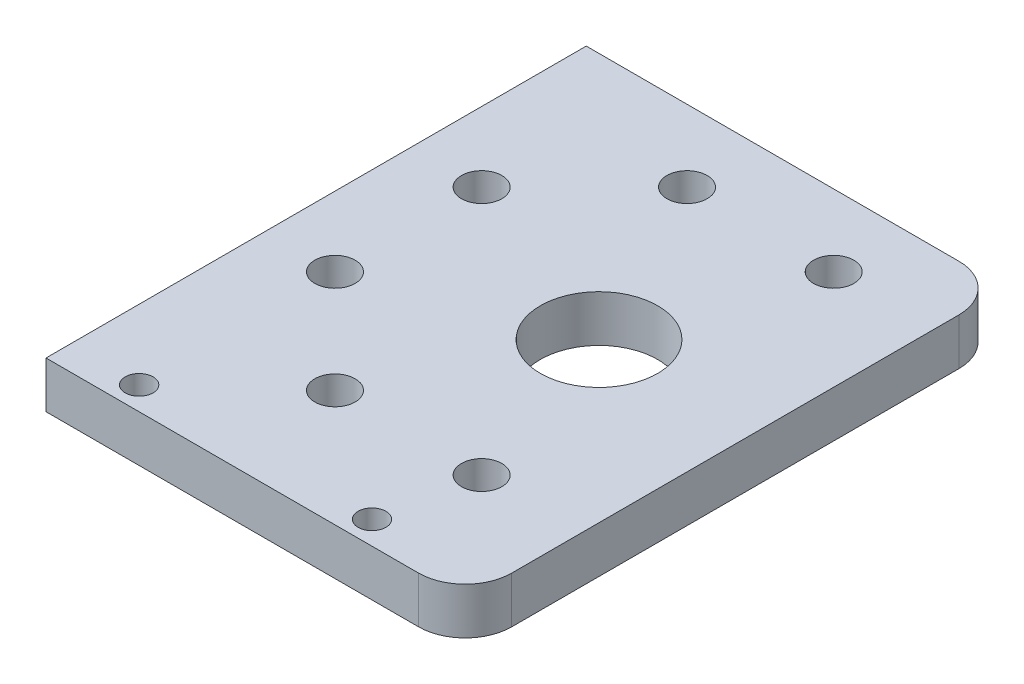
ISO-10303-21;
HEADER;
FILE_DESCRIPTION(('STEP AP214'),'2;1');
FILE_NAME('part.step','',(''),(''),'','','');
FILE_SCHEMA(('AUTOMOTIVE_DESIGN { 1 0 10303 214 1 1 1 1 }'));
ENDSEC;
DATA;
#1=APPLICATION_CONTEXT('core data for automotive mechanical design processes');
#2=APPLICATION_PROTOCOL_DEFINITION('international standard','automotive_design',2000,#1);
#3=PRODUCT_CONTEXT('',#1,'mechanical');
#4=PRODUCT('Part','Part','',(#3));
#5=PRODUCT_RELATED_PRODUCT_CATEGORY('part','',(#4));
#6=PRODUCT_DEFINITION_FORMATION('','',#4);
#7=PRODUCT_DEFINITION_CONTEXT('part definition',#1,'design');
#8=PRODUCT_DEFINITION('design','',#6,#7);
#9=PRODUCT_DEFINITION_SHAPE('','',#8);
#10=(LENGTH_UNIT() NAMED_UNIT(*) SI_UNIT(.MILLI.,.METRE.));
#11=(NAMED_UNIT(*) PLANE_ANGLE_UNIT() SI_UNIT($,.RADIAN.));
#12=(NAMED_UNIT(*) SI_UNIT($,.STERADIAN.) SOLID_ANGLE_UNIT());
#13=UNCERTAINTY_MEASURE_WITH_UNIT(LENGTH_MEASURE(1.E-05),#10,'distance_accuracy_value','');
#14=(GEOMETRIC_REPRESENTATION_CONTEXT(3) GLOBAL_UNCERTAINTY_ASSIGNED_CONTEXT((#13)) GLOBAL_UNIT_ASSIGNED_CONTEXT((#10,
#11,#12)) REPRESENTATION_CONTEXT('',''));
#15=CARTESIAN_POINT('',(0.,0.,0.));
#16=DIRECTION('',(0.,0.,1.));
#17=DIRECTION('',(1.,0.,0.));
#18=AXIS2_PLACEMENT_3D('',#15,#16,#17);
#19=CARTESIAN_POINT('',(-28.575,6.35,-36.83));
#20=DIRECTION('',(1.,0.,0.));
#21=DIRECTION('',(0.,0.,-1.));
#22=AXIS2_PLACEMENT_3D('',#19,#20,#21);
#23=PLANE('',#22);
#24=CARTESIAN_POINT('',(-28.575,3.175,26.67));
#25=DIRECTION('',(-1.,0.,0.));
#26=DIRECTION('',(0.,0.,1.));
#27=AXIS2_PLACEMENT_3D('',#24,#25,#26);
#28=CIRCLE('',#27,1.35255);
#29=CARTESIAN_POINT('',(-28.575,3.175,28.02255));
#30=VERTEX_POINT('',#29);
#31=EDGE_CURVE('E104',#30,#30,#28,.T.);
#32=ORIENTED_EDGE('',*,*,#31,.F.);
#33=EDGE_LOOP('',(#32));
#34=FACE_BOUND('',#33,.T.);
#35=CARTESIAN_POINT('',(-28.575,3.175,-21.59));
#36=DIRECTION('',(-1.,0.,0.));
#37=DIRECTION('',(0.,0.,1.));
#38=AXIS2_PLACEMENT_3D('',#35,#36,#37);
#39=CIRCLE('',#38,1.35255);
#40=CARTESIAN_POINT('',(-28.575,3.175,-20.23745));
#41=VERTEX_POINT('',#40);
#42=EDGE_CURVE('E103',#41,#41,#39,.T.);
#43=ORIENTED_EDGE('',*,*,#42,.F.);
#44=EDGE_LOOP('',(#43));
#45=FACE_BOUND('',#44,.T.);
#46=DIRECTION('',(0.,0.,1.));
#47=VECTOR('',#46,1.);
#48=CARTESIAN_POINT('',(-28.575,0.,-36.83));
#49=LINE('',#48,#47);
#50=CARTESIAN_POINT('',(-28.575,0.,-36.83));
#51=VERTEX_POINT('',#50);
#52=CARTESIAN_POINT('',(-28.575,0.,36.83));
#53=VERTEX_POINT('',#52);
#54=EDGE_CURVE('E162',#51,#53,#49,.T.);
#55=ORIENTED_EDGE('',*,*,#54,.T.);
#56=DIRECTION('',(0.,-1.,0.));
#57=VECTOR('',#56,1.);
#58=CARTESIAN_POINT('',(-28.575,6.35,36.83));
#59=LINE('',#58,#57);
#60=CARTESIAN_POINT('',(-28.575,6.35,36.83));
#61=VERTEX_POINT('',#60);
#62=EDGE_CURVE('E185',#61,#53,#59,.T.);
#63=ORIENTED_EDGE('',*,*,#62,.F.);
#64=DIRECTION('',(0.,0.,1.));
#65=VECTOR('',#64,1.);
#66=CARTESIAN_POINT('',(-28.575,6.35,-36.83));
#67=LINE('',#66,#65);
#68=CARTESIAN_POINT('',(-28.575,6.35,-36.83));
#69=VERTEX_POINT('',#68);
#70=EDGE_CURVE('E163',#69,#61,#67,.T.);
#71=ORIENTED_EDGE('',*,*,#70,.F.);
#72=DIRECTION('',(0.,-1.,0.));
#73=VECTOR('',#72,1.);
#74=CARTESIAN_POINT('',(-28.575,6.35,-36.83));
#75=LINE('',#74,#73);
#76=EDGE_CURVE('E174',#69,#51,#75,.T.);
#77=ORIENTED_EDGE('',*,*,#76,.T.);
#78=EDGE_LOOP('',(#55,#63,#71,#77));
#79=FACE_BOUND('',#78,.T.);
#80=ADVANCED_FACE('F33',(#34,#45,#79),#23,.F.);
#81=CARTESIAN_POINT('',(-28.575,6.35,36.83));
#82=DIRECTION('',(0.,0.,-1.));
#83=DIRECTION('',(-1.,0.,0.));
#84=AXIS2_PLACEMENT_3D('',#81,#82,#83);
#85=PLANE('',#84);
#86=DIRECTION('',(1.,0.,0.));
#87=VECTOR('',#86,1.);
#88=CARTESIAN_POINT('',(-28.575,0.,36.83));
#89=LINE('',#88,#87);
#90=CARTESIAN_POINT('',(22.225,0.,36.83));
#91=VERTEX_POINT('',#90);
#92=EDGE_CURVE('E177',#53,#91,#89,.T.);
#93=ORIENTED_EDGE('',*,*,#92,.T.);
#94=DIRECTION('',(0.,-1.,0.));
#95=VECTOR('',#94,1.);
#96=CARTESIAN_POINT('',(22.225,6.35,36.83));
#97=LINE('',#96,#95);
#98=CARTESIAN_POINT('',(22.225,6.35,36.83));
#99=VERTEX_POINT('',#98);
#100=EDGE_CURVE('E56',#91,#99,#97,.F.);
#101=ORIENTED_EDGE('',*,*,#100,.T.);
#102=DIRECTION('',(1.,0.,0.));
#103=VECTOR('',#102,1.);
#104=CARTESIAN_POINT('',(-28.575,6.35,36.83));
#105=LINE('',#104,#103);
#106=EDGE_CURVE('E166',#61,#99,#105,.T.);
#107=ORIENTED_EDGE('',*,*,#106,.F.);
#108=ORIENTED_EDGE('',*,*,#62,.T.);
#109=EDGE_LOOP('',(#93,#101,#107,#108));
#110=FACE_BOUND('',#109,.T.);
#111=ADVANCED_FACE('F216',(#110),#85,.F.);
#112=CARTESIAN_POINT('',(28.575,6.35,-36.83));
#113=DIRECTION('',(1.,0.,0.));
#114=DIRECTION('',(0.,0.,-1.));
#115=AXIS2_PLACEMENT_3D('',#112,#113,#114);
#116=PLANE('',#115);
#117=DIRECTION('',(0.,0.,1.));
#118=VECTOR('',#117,1.);
#119=CARTESIAN_POINT('',(28.575,6.35,-36.83));
#120=LINE('',#119,#118);
#121=CARTESIAN_POINT('',(28.575,6.35,-30.48));
#122=VERTEX_POINT('',#121);
#123=CARTESIAN_POINT('',(28.575,6.35,30.48));
#124=VERTEX_POINT('',#123);
#125=EDGE_CURVE('E169',#122,#124,#120,.T.);
#126=ORIENTED_EDGE('',*,*,#125,.T.);
#127=DIRECTION('',(0.,-1.,0.));
#128=VECTOR('',#127,1.);
#129=CARTESIAN_POINT('',(28.575,0.,30.48));
#130=LINE('',#129,#128);
#131=CARTESIAN_POINT('',(28.575,0.,30.48));
#132=VERTEX_POINT('',#131);
#133=EDGE_CURVE('E196',#124,#132,#130,.T.);
#134=ORIENTED_EDGE('',*,*,#133,.T.);
#135=DIRECTION('',(0.,0.,1.));
#136=VECTOR('',#135,1.);
#137=CARTESIAN_POINT('',(28.575,0.,-36.83));
#138=LINE('',#137,#136);
#139=CARTESIAN_POINT('',(28.575,0.,-30.48));
#140=VERTEX_POINT('',#139);
#141=EDGE_CURVE('E179',#140,#132,#138,.T.);
#142=ORIENTED_EDGE('',*,*,#141,.F.);
#143=DIRECTION('',(0.,-1.,0.));
#144=VECTOR('',#143,1.);
#145=CARTESIAN_POINT('',(28.575,6.35,-30.48));
#146=LINE('',#145,#144);
#147=EDGE_CURVE('E188',#140,#122,#146,.F.);
#148=ORIENTED_EDGE('',*,*,#147,.T.);
#149=EDGE_LOOP('',(#126,#134,#142,#148));
#150=FACE_BOUND('',#149,.T.);
#151=ADVANCED_FACE('F209',(#150),#116,.T.);
#152=CARTESIAN_POINT('',(-28.575,6.35,-36.83));
#153=DIRECTION('',(0.,0.,-1.));
#154=DIRECTION('',(-1.,0.,0.));
#155=AXIS2_PLACEMENT_3D('',#152,#153,#154);
#156=PLANE('',#155);
#157=DIRECTION('',(1.,0.,0.));
#158=VECTOR('',#157,1.);
#159=CARTESIAN_POINT('',(-28.575,6.35,-36.83));
#160=LINE('',#159,#158);
#161=CARTESIAN_POINT('',(22.225,6.35,-36.83));
#162=VERTEX_POINT('',#161);
#163=EDGE_CURVE('E172',#69,#162,#160,.T.);
#164=ORIENTED_EDGE('',*,*,#163,.T.);
#165=DIRECTION('',(0.,-1.,0.));
#166=VECTOR('',#165,1.);
#167=CARTESIAN_POINT('',(22.225,6.35,-36.83));
#168=LINE('',#167,#166);
#169=CARTESIAN_POINT('',(22.225,0.,-36.83));
#170=VERTEX_POINT('',#169);
#171=EDGE_CURVE('E11',#162,#170,#168,.T.);
#172=ORIENTED_EDGE('',*,*,#171,.T.);
#173=DIRECTION('',(1.,0.,0.));
#174=VECTOR('',#173,1.);
#175=CARTESIAN_POINT('',(-28.575,0.,-36.83));
#176=LINE('',#175,#174);
#177=EDGE_CURVE('E167',#51,#170,#176,.T.);
#178=ORIENTED_EDGE('',*,*,#177,.F.);
#179=ORIENTED_EDGE('',*,*,#76,.F.);
#180=EDGE_LOOP('',(#164,#172,#178,#179));
#181=FACE_BOUND('',#180,.T.);
#182=ADVANCED_FACE('F222',(#181),#156,.T.);
#183=CARTESIAN_POINT('',(0.,6.35,0.));
#184=DIRECTION('',(0.,1.,0.));
#185=DIRECTION('',(0.,0.,1.));
#186=AXIS2_PLACEMENT_3D('',#183,#184,#185);
#187=PLANE('',#186);
#188=CARTESIAN_POINT('',(6.94999999999999,6.35,-3.04500000600001));
#189=DIRECTION('',(0.,1.,0.));
#190=DIRECTION('',(0.,0.,1.));
#191=AXIS2_PLACEMENT_3D('',#188,#189,#190);
#192=CIRCLE('',#191,8.);
#193=CARTESIAN_POINT('',(6.94999999999999,6.35,4.95499999399999));
#194=VERTEX_POINT('',#193);
#195=EDGE_CURVE('E114',#194,#194,#192,.T.);
#196=ORIENTED_EDGE('',*,*,#195,.F.);
#197=EDGE_LOOP('',(#196));
#198=FACE_BOUND('',#197,.T.);
#199=CARTESIAN_POINT('',(-19.05,6.35,-13.045000006));
#200=DIRECTION('',(0.,1.,0.));
#201=DIRECTION('',(0.,0.,1.));
#202=AXIS2_PLACEMENT_3D('',#199,#200,#201);
#203=CIRCLE('',#202,2.75);
#204=CARTESIAN_POINT('',(-19.05,6.35,-10.295000006));
#205=VERTEX_POINT('',#204);
#206=EDGE_CURVE('E118',#205,#205,#203,.T.);
#207=ORIENTED_EDGE('',*,*,#206,.F.);
#208=EDGE_LOOP('',(#207));
#209=FACE_BOUND('',#208,.T.);
#210=CARTESIAN_POINT('',(-19.05,6.35,6.95499999399998));
#211=DIRECTION('',(0.,1.,0.));
#212=DIRECTION('',(0.,0.,1.));
#213=AXIS2_PLACEMENT_3D('',#210,#211,#212);
#214=CIRCLE('',#213,2.75);
#215=CARTESIAN_POINT('',(-19.05,6.35,9.70499999399998));
#216=VERTEX_POINT('',#215);
#217=EDGE_CURVE('E126',#216,#216,#214,.T.);
#218=ORIENTED_EDGE('',*,*,#217,.F.);
#219=EDGE_LOOP('',(#218));
#220=FACE_BOUND('',#219,.T.);
#221=CARTESIAN_POINT('',(14.95,6.35,-27.045));
#222=DIRECTION('',(0.,1.,0.));
#223=DIRECTION('',(0.,0.,1.));
#224=AXIS2_PLACEMENT_3D('',#221,#222,#223);
#225=CIRCLE('',#224,2.75);
#226=CARTESIAN_POINT('',(14.95,6.35,-24.295));
#227=VERTEX_POINT('',#226);
#228=EDGE_CURVE('E130',#227,#227,#225,.T.);
#229=ORIENTED_EDGE('',*,*,#228,.F.);
#230=EDGE_LOOP('',(#229));
#231=FACE_BOUND('',#230,.T.);
#232=CARTESIAN_POINT('',(14.95,6.35,20.955));
#233=DIRECTION('',(0.,1.,0.));
#234=DIRECTION('',(0.,0.,1.));
#235=AXIS2_PLACEMENT_3D('',#232,#233,#234);
#236=CIRCLE('',#235,2.75);
#237=CARTESIAN_POINT('',(14.95,6.35,23.705));
#238=VERTEX_POINT('',#237);
#239=EDGE_CURVE('E134',#238,#238,#236,.T.);
#240=ORIENTED_EDGE('',*,*,#239,.F.);
#241=EDGE_LOOP('',(#240));
#242=FACE_BOUND('',#241,.T.);
#243=CARTESIAN_POINT('',(-5.05000000000001,6.35,-27.045));
#244=DIRECTION('',(0.,1.,0.));
#245=DIRECTION('',(0.,0.,1.));
#246=AXIS2_PLACEMENT_3D('',#243,#244,#245);
#247=CIRCLE('',#246,2.75);
#248=CARTESIAN_POINT('',(-5.05000000000001,6.35,-24.295));
#249=VERTEX_POINT('',#248);
#250=EDGE_CURVE('E140',#249,#249,#247,.T.);
#251=ORIENTED_EDGE('',*,*,#250,.F.);
#252=EDGE_LOOP('',(#251));
#253=FACE_BOUND('',#252,.T.);
#254=CARTESIAN_POINT('',(-5.05000000000001,6.35,20.955));
#255=DIRECTION('',(0.,1.,0.));
#256=DIRECTION('',(0.,0.,1.));
#257=AXIS2_PLACEMENT_3D('',#254,#255,#256);
#258=CIRCLE('',#257,2.75);
#259=CARTESIAN_POINT('',(-5.05000000000001,6.35,23.705));
#260=VERTEX_POINT('',#259);
#261=EDGE_CURVE('E144',#260,#260,#258,.T.);
#262=ORIENTED_EDGE('',*,*,#261,.F.);
#263=EDGE_LOOP('',(#262));
#264=FACE_BOUND('',#263,.T.);
#265=CARTESIAN_POINT('',(-19.05,6.35,33.655));
#266=DIRECTION('',(0.,1.,0.));
#267=DIRECTION('',(0.,0.,1.));
#268=AXIS2_PLACEMENT_3D('',#265,#266,#267);
#269=CIRCLE('',#268,1.89865);
#270=CARTESIAN_POINT('',(-19.05,6.35,35.55365));
#271=VERTEX_POINT('',#270);
#272=EDGE_CURVE('E150',#271,#271,#269,.T.);
#273=ORIENTED_EDGE('',*,*,#272,.F.);
#274=EDGE_LOOP('',(#273));
#275=FACE_BOUND('',#274,.T.);
#276=CARTESIAN_POINT('',(12.7,6.35,33.655));
#277=DIRECTION('',(0.,1.,0.));
#278=DIRECTION('',(0.,0.,1.));
#279=AXIS2_PLACEMENT_3D('',#276,#277,#278);
#280=CIRCLE('',#279,1.89865);
#281=CARTESIAN_POINT('',(12.7,6.35,35.55365));
#282=VERTEX_POINT('',#281);
#283=EDGE_CURVE('E156',#282,#282,#280,.T.);
#284=ORIENTED_EDGE('',*,*,#283,.F.);
#285=EDGE_LOOP('',(#284));
#286=FACE_BOUND('',#285,.T.);
#287=ORIENTED_EDGE('',*,*,#106,.T.);
#288=CARTESIAN_POINT('',(22.225,6.35,30.48));
#289=DIRECTION('',(0.,1.,0.));
#290=DIRECTION('',(0.,0.,1.));
#291=AXIS2_PLACEMENT_3D('',#288,#289,#290);
#292=CIRCLE('',#291,6.35);
#293=EDGE_CURVE('E41',#99,#124,#292,.T.);
#294=ORIENTED_EDGE('',*,*,#293,.T.);
#295=ORIENTED_EDGE('',*,*,#125,.F.);
#296=CARTESIAN_POINT('',(22.225,6.35,-30.48));
#297=DIRECTION('',(0.,1.,0.));
#298=DIRECTION('',(0.,0.,1.));
#299=AXIS2_PLACEMENT_3D('',#296,#297,#298);
#300=CIRCLE('',#299,6.35);
#301=EDGE_CURVE('E48',#122,#162,#300,.T.);
#302=ORIENTED_EDGE('',*,*,#301,.T.);
#303=ORIENTED_EDGE('',*,*,#163,.F.);
#304=ORIENTED_EDGE('',*,*,#70,.T.);
#305=EDGE_LOOP('',(#287,#294,#295,#302,#303,#304));
#306=FACE_BOUND('',#305,.T.);
#307=ADVANCED_FACE('F205',(#198,#209,#220,#231,#242,#253,#264,#275,#286,#306),#187,.T.);
#308=CARTESIAN_POINT('',(0.,0.,0.));
#309=DIRECTION('',(0.,1.,0.));
#310=DIRECTION('',(0.,0.,1.));
#311=AXIS2_PLACEMENT_3D('',#308,#309,#310);
#312=PLANE('',#311);
#313=CARTESIAN_POINT('',(6.94999999999999,0.,-3.04500000600001));
#314=DIRECTION('',(0.,1.,0.));
#315=DIRECTION('',(0.,0.,1.));
#316=AXIS2_PLACEMENT_3D('',#313,#314,#315);
#317=CIRCLE('',#316,8.);
#318=CARTESIAN_POINT('',(6.94999999999999,0.,4.95499999399999));
#319=VERTEX_POINT('',#318);
#320=EDGE_CURVE('E115',#319,#319,#317,.T.);
#321=ORIENTED_EDGE('',*,*,#320,.T.);
#322=EDGE_LOOP('',(#321));
#323=FACE_BOUND('',#322,.T.);
#324=CARTESIAN_POINT('',(-19.05,0.,-13.045000006));
#325=DIRECTION('',(0.,1.,0.));
#326=DIRECTION('',(0.,0.,1.));
#327=AXIS2_PLACEMENT_3D('',#324,#325,#326);
#328=CIRCLE('',#327,2.75);
#329=CARTESIAN_POINT('',(-19.05,0.,-10.295000006));
#330=VERTEX_POINT('',#329);
#331=EDGE_CURVE('E123',#330,#330,#328,.T.);
#332=ORIENTED_EDGE('',*,*,#331,.T.);
#333=EDGE_LOOP('',(#332));
#334=FACE_BOUND('',#333,.T.);
#335=CARTESIAN_POINT('',(-19.05,0.,6.95499999399998));
#336=DIRECTION('',(0.,1.,0.));
#337=DIRECTION('',(0.,0.,1.));
#338=AXIS2_PLACEMENT_3D('',#335,#336,#337);
#339=CIRCLE('',#338,2.75);
#340=CARTESIAN_POINT('',(-19.05,0.,9.70499999399998));
#341=VERTEX_POINT('',#340);
#342=EDGE_CURVE('E129',#341,#341,#339,.T.);
#343=ORIENTED_EDGE('',*,*,#342,.T.);
#344=EDGE_LOOP('',(#343));
#345=FACE_BOUND('',#344,.T.);
#346=CARTESIAN_POINT('',(14.95,0.,-27.045));
#347=DIRECTION('',(0.,1.,0.));
#348=DIRECTION('',(0.,0.,1.));
#349=AXIS2_PLACEMENT_3D('',#346,#347,#348);
#350=CIRCLE('',#349,2.75);
#351=CARTESIAN_POINT('',(14.95,0.,-24.295));
#352=VERTEX_POINT('',#351);
#353=EDGE_CURVE('E133',#352,#352,#350,.T.);
#354=ORIENTED_EDGE('',*,*,#353,.T.);
#355=EDGE_LOOP('',(#354));
#356=FACE_BOUND('',#355,.T.);
#357=CARTESIAN_POINT('',(14.95,0.,20.955));
#358=DIRECTION('',(0.,1.,0.));
#359=DIRECTION('',(0.,0.,1.));
#360=AXIS2_PLACEMENT_3D('',#357,#358,#359);
#361=CIRCLE('',#360,2.75);
#362=CARTESIAN_POINT('',(14.95,0.,23.705));
#363=VERTEX_POINT('',#362);
#364=EDGE_CURVE('E137',#363,#363,#361,.T.);
#365=ORIENTED_EDGE('',*,*,#364,.T.);
#366=EDGE_LOOP('',(#365));
#367=FACE_BOUND('',#366,.T.);
#368=CARTESIAN_POINT('',(-5.05000000000001,0.,-27.045));
#369=DIRECTION('',(0.,1.,0.));
#370=DIRECTION('',(0.,0.,1.));
#371=AXIS2_PLACEMENT_3D('',#368,#369,#370);
#372=CIRCLE('',#371,2.75);
#373=CARTESIAN_POINT('',(-5.05000000000001,0.,-24.295));
#374=VERTEX_POINT('',#373);
#375=EDGE_CURVE('E143',#374,#374,#372,.T.);
#376=ORIENTED_EDGE('',*,*,#375,.T.);
#377=EDGE_LOOP('',(#376));
#378=FACE_BOUND('',#377,.T.);
#379=CARTESIAN_POINT('',(-5.05000000000001,0.,20.955));
#380=DIRECTION('',(0.,1.,0.));
#381=DIRECTION('',(0.,0.,1.));
#382=AXIS2_PLACEMENT_3D('',#379,#380,#381);
#383=CIRCLE('',#382,2.75);
#384=CARTESIAN_POINT('',(-5.05000000000001,0.,23.705));
#385=VERTEX_POINT('',#384);
#386=EDGE_CURVE('E147',#385,#385,#383,.T.);
#387=ORIENTED_EDGE('',*,*,#386,.T.);
#388=EDGE_LOOP('',(#387));
#389=FACE_BOUND('',#388,.T.);
#390=CARTESIAN_POINT('',(-19.05,0.,33.655));
#391=DIRECTION('',(0.,1.,0.));
#392=DIRECTION('',(0.,0.,1.));
#393=AXIS2_PLACEMENT_3D('',#390,#391,#392);
#394=CIRCLE('',#393,1.89865);
#395=CARTESIAN_POINT('',(-19.05,0.,35.55365));
#396=VERTEX_POINT('',#395);
#397=EDGE_CURVE('E153',#396,#396,#394,.T.);
#398=ORIENTED_EDGE('',*,*,#397,.T.);
#399=EDGE_LOOP('',(#398));
#400=FACE_BOUND('',#399,.T.);
#401=CARTESIAN_POINT('',(12.7,0.,33.655));
#402=DIRECTION('',(0.,1.,0.));
#403=DIRECTION('',(0.,0.,1.));
#404=AXIS2_PLACEMENT_3D('',#401,#402,#403);
#405=CIRCLE('',#404,1.89865);
#406=CARTESIAN_POINT('',(12.7,0.,35.55365));
#407=VERTEX_POINT('',#406);
#408=EDGE_CURVE('E159',#407,#407,#405,.T.);
#409=ORIENTED_EDGE('',*,*,#408,.T.);
#410=EDGE_LOOP('',(#409));
#411=FACE_BOUND('',#410,.T.);
#412=ORIENTED_EDGE('',*,*,#141,.T.);
#413=CARTESIAN_POINT('',(22.225,0.,30.48));
#414=DIRECTION('',(0.,1.,0.));
#415=DIRECTION('',(0.,0.,1.));
#416=AXIS2_PLACEMENT_3D('',#413,#414,#415);
#417=CIRCLE('',#416,6.35);
#418=EDGE_CURVE('E201',#132,#91,#417,.F.);
#419=ORIENTED_EDGE('',*,*,#418,.T.);
#420=ORIENTED_EDGE('',*,*,#92,.F.);
#421=ORIENTED_EDGE('',*,*,#54,.F.);
#422=ORIENTED_EDGE('',*,*,#177,.T.);
#423=CARTESIAN_POINT('',(22.225,0.,-30.48));
#424=DIRECTION('',(0.,1.,0.));
#425=DIRECTION('',(0.,0.,1.));
#426=AXIS2_PLACEMENT_3D('',#423,#424,#425);
#427=CIRCLE('',#426,6.35);
#428=EDGE_CURVE('E199',#170,#140,#427,.F.);
#429=ORIENTED_EDGE('',*,*,#428,.T.);
#430=EDGE_LOOP('',(#412,#419,#420,#421,#422,#429));
#431=FACE_BOUND('',#430,.T.);
#432=ADVANCED_FACE('F214',(#323,#334,#345,#356,#367,#378,#389,#400,#411,#431),#312,.F.);
#433=CARTESIAN_POINT('',(12.7,6.35,33.655));
#434=DIRECTION('',(0.,1.,0.));
#435=DIRECTION('',(0.,0.,1.));
#436=AXIS2_PLACEMENT_3D('',#433,#434,#435);
#437=CYLINDRICAL_SURFACE('',#436,1.89865);
#438=ORIENTED_EDGE('',*,*,#283,.T.);
#439=EDGE_LOOP('',(#438));
#440=FACE_BOUND('',#439,.T.);
#441=ORIENTED_EDGE('',*,*,#408,.F.);
#442=EDGE_LOOP('',(#441));
#443=FACE_BOUND('',#442,.T.);
#444=ADVANCED_FACE('F245',(#440,#443),#437,.F.);
#445=CARTESIAN_POINT('',(-19.05,6.35,33.655));
#446=DIRECTION('',(0.,1.,0.));
#447=DIRECTION('',(0.,0.,1.));
#448=AXIS2_PLACEMENT_3D('',#445,#446,#447);
#449=CYLINDRICAL_SURFACE('',#448,1.89865);
#450=ORIENTED_EDGE('',*,*,#272,.T.);
#451=EDGE_LOOP('',(#450));
#452=FACE_BOUND('',#451,.T.);
#453=ORIENTED_EDGE('',*,*,#397,.F.);
#454=EDGE_LOOP('',(#453));
#455=FACE_BOUND('',#454,.T.);
#456=ADVANCED_FACE('F252',(#452,#455),#449,.F.);
#457=CARTESIAN_POINT('',(-5.05000000000001,6.35,20.955));
#458=DIRECTION('',(0.,1.,0.));
#459=DIRECTION('',(0.,0.,1.));
#460=AXIS2_PLACEMENT_3D('',#457,#458,#459);
#461=CYLINDRICAL_SURFACE('',#460,2.75);
#462=ORIENTED_EDGE('',*,*,#261,.T.);
#463=EDGE_LOOP('',(#462));
#464=FACE_BOUND('',#463,.T.);
#465=ORIENTED_EDGE('',*,*,#386,.F.);
#466=EDGE_LOOP('',(#465));
#467=FACE_BOUND('',#466,.T.);
#468=ADVANCED_FACE('F256',(#464,#467),#461,.F.);
#469=CARTESIAN_POINT('',(-5.05000000000001,6.35,-27.045));
#470=DIRECTION('',(0.,1.,0.));
#471=DIRECTION('',(0.,0.,1.));
#472=AXIS2_PLACEMENT_3D('',#469,#470,#471);
#473=CYLINDRICAL_SURFACE('',#472,2.75);
#474=ORIENTED_EDGE('',*,*,#250,.T.);
#475=EDGE_LOOP('',(#474));
#476=FACE_BOUND('',#475,.T.);
#477=ORIENTED_EDGE('',*,*,#375,.F.);
#478=EDGE_LOOP('',(#477));
#479=FACE_BOUND('',#478,.T.);
#480=ADVANCED_FACE('F260',(#476,#479),#473,.F.);
#481=CARTESIAN_POINT('',(14.95,6.35,20.955));
#482=DIRECTION('',(0.,1.,0.));
#483=DIRECTION('',(0.,0.,1.));
#484=AXIS2_PLACEMENT_3D('',#481,#482,#483);
#485=CYLINDRICAL_SURFACE('',#484,2.75);
#486=ORIENTED_EDGE('',*,*,#239,.T.);
#487=EDGE_LOOP('',(#486));
#488=FACE_BOUND('',#487,.T.);
#489=ORIENTED_EDGE('',*,*,#364,.F.);
#490=EDGE_LOOP('',(#489));
#491=FACE_BOUND('',#490,.T.);
#492=ADVANCED_FACE('F264',(#488,#491),#485,.F.);
#493=CARTESIAN_POINT('',(14.95,6.35,-27.045));
#494=DIRECTION('',(0.,1.,0.));
#495=DIRECTION('',(0.,0.,1.));
#496=AXIS2_PLACEMENT_3D('',#493,#494,#495);
#497=CYLINDRICAL_SURFACE('',#496,2.75);
#498=ORIENTED_EDGE('',*,*,#228,.T.);
#499=EDGE_LOOP('',(#498));
#500=FACE_BOUND('',#499,.T.);
#501=ORIENTED_EDGE('',*,*,#353,.F.);
#502=EDGE_LOOP('',(#501));
#503=FACE_BOUND('',#502,.T.);
#504=ADVANCED_FACE('F268',(#500,#503),#497,.F.);
#505=CARTESIAN_POINT('',(-19.05,6.35,6.95499999399998));
#506=DIRECTION('',(0.,1.,0.));
#507=DIRECTION('',(0.,0.,1.));
#508=AXIS2_PLACEMENT_3D('',#505,#506,#507);
#509=CYLINDRICAL_SURFACE('',#508,2.75);
#510=ORIENTED_EDGE('',*,*,#217,.T.);
#511=EDGE_LOOP('',(#510));
#512=FACE_BOUND('',#511,.T.);
#513=ORIENTED_EDGE('',*,*,#342,.F.);
#514=EDGE_LOOP('',(#513));
#515=FACE_BOUND('',#514,.T.);
#516=ADVANCED_FACE('F272',(#512,#515),#509,.F.);
#517=CARTESIAN_POINT('',(-19.05,6.35,-13.045000006));
#518=DIRECTION('',(0.,1.,0.));
#519=DIRECTION('',(0.,0.,1.));
#520=AXIS2_PLACEMENT_3D('',#517,#518,#519);
#521=CYLINDRICAL_SURFACE('',#520,2.75);
#522=ORIENTED_EDGE('',*,*,#206,.T.);
#523=EDGE_LOOP('',(#522));
#524=FACE_BOUND('',#523,.T.);
#525=ORIENTED_EDGE('',*,*,#331,.F.);
#526=EDGE_LOOP('',(#525));
#527=FACE_BOUND('',#526,.T.);
#528=ADVANCED_FACE('F276',(#524,#527),#521,.F.);
#529=CARTESIAN_POINT('',(6.94999999999999,0.,-3.04500000600001));
#530=DIRECTION('',(0.,1.,0.));
#531=DIRECTION('',(0.,0.,1.));
#532=AXIS2_PLACEMENT_3D('',#529,#530,#531);
#533=CYLINDRICAL_SURFACE('',#532,8.);
#534=ORIENTED_EDGE('',*,*,#320,.F.);
#535=EDGE_LOOP('',(#534));
#536=FACE_BOUND('',#535,.T.);
#537=ORIENTED_EDGE('',*,*,#195,.T.);
#538=EDGE_LOOP('',(#537));
#539=FACE_BOUND('',#538,.T.);
#540=ADVANCED_FACE('F280',(#536,#539),#533,.F.);
#541=CARTESIAN_POINT('',(-15.875,3.175,-21.59));
#542=DIRECTION('',(-1.,0.,0.));
#543=DIRECTION('',(0.,0.,1.));
#544=AXIS2_PLACEMENT_3D('',#541,#542,#543);
#545=CONICAL_SURFACE('',#544,1.35255,1.02974425867665);
#546=CARTESIAN_POINT('',(-15.0623059697343,3.175,-21.59));
#547=VERTEX_POINT('',#546);
#548=VERTEX_LOOP('',#547);
#549=FACE_BOUND('',#548,.T.);
#550=CARTESIAN_POINT('',(-15.875,3.175,-21.59));
#551=DIRECTION('',(-1.,0.,0.));
#552=DIRECTION('',(0.,0.,1.));
#553=AXIS2_PLACEMENT_3D('',#550,#551,#552);
#554=CIRCLE('',#553,1.35255);
#555=CARTESIAN_POINT('',(-15.875,3.175,-20.23745));
#556=VERTEX_POINT('',#555);
#557=EDGE_CURVE('E107',#556,#556,#554,.T.);
#558=ORIENTED_EDGE('',*,*,#557,.T.);
#559=EDGE_LOOP('',(#558));
#560=FACE_BOUND('',#559,.T.);
#561=ADVANCED_FACE('F284',(#549,#560),#545,.F.);
#562=CARTESIAN_POINT('',(-28.575,3.175,-21.59));
#563=DIRECTION('',(-1.,0.,0.));
#564=DIRECTION('',(0.,0.,1.));
#565=AXIS2_PLACEMENT_3D('',#562,#563,#564);
#566=CYLINDRICAL_SURFACE('',#565,1.35255);
#567=ORIENTED_EDGE('',*,*,#557,.F.);
#568=EDGE_LOOP('',(#567));
#569=FACE_BOUND('',#568,.T.);
#570=ORIENTED_EDGE('',*,*,#42,.T.);
#571=EDGE_LOOP('',(#570));
#572=FACE_BOUND('',#571,.T.);
#573=ADVANCED_FACE('F97',(#569,#572),#566,.F.);
#574=CARTESIAN_POINT('',(-15.875,3.175,26.67));
#575=DIRECTION('',(-1.,0.,0.));
#576=DIRECTION('',(0.,0.,1.));
#577=AXIS2_PLACEMENT_3D('',#574,#575,#576);
#578=CONICAL_SURFACE('',#577,1.35255,1.02974425867665);
#579=CARTESIAN_POINT('',(-15.0623059697343,3.175,26.67));
#580=VERTEX_POINT('',#579);
#581=VERTEX_LOOP('',#580);
#582=FACE_BOUND('',#581,.T.);
#583=CARTESIAN_POINT('',(-15.875,3.175,26.67));
#584=DIRECTION('',(-1.,0.,0.));
#585=DIRECTION('',(0.,0.,1.));
#586=AXIS2_PLACEMENT_3D('',#583,#584,#585);
#587=CIRCLE('',#586,1.35255);
#588=CARTESIAN_POINT('',(-15.875,3.175,28.02255));
#589=VERTEX_POINT('',#588);
#590=EDGE_CURVE('E101',#589,#589,#587,.T.);
#591=ORIENTED_EDGE('',*,*,#590,.T.);
#592=EDGE_LOOP('',(#591));
#593=FACE_BOUND('',#592,.T.);
#594=ADVANCED_FACE('F93',(#582,#593),#578,.F.);
#595=CARTESIAN_POINT('',(-28.575,3.175,26.67));
#596=DIRECTION('',(-1.,0.,0.));
#597=DIRECTION('',(0.,0.,1.));
#598=AXIS2_PLACEMENT_3D('',#595,#596,#597);
#599=CYLINDRICAL_SURFACE('',#598,1.35255);
#600=ORIENTED_EDGE('',*,*,#590,.F.);
#601=EDGE_LOOP('',(#600));
#602=FACE_BOUND('',#601,.T.);
#603=ORIENTED_EDGE('',*,*,#31,.T.);
#604=EDGE_LOOP('',(#603));
#605=FACE_BOUND('',#604,.T.);
#606=ADVANCED_FACE('F96',(#602,#605),#599,.F.);
#607=CARTESIAN_POINT('',(22.225,6.35,30.48));
#608=DIRECTION('',(0.,1.,0.));
#609=DIRECTION('',(0.,0.,1.));
#610=AXIS2_PLACEMENT_3D('',#607,#608,#609);
#611=CYLINDRICAL_SURFACE('',#610,6.35);
#612=ORIENTED_EDGE('',*,*,#293,.F.);
#613=ORIENTED_EDGE('',*,*,#100,.F.);
#614=ORIENTED_EDGE('',*,*,#418,.F.);
#615=ORIENTED_EDGE('',*,*,#133,.F.);
#616=EDGE_LOOP('',(#612,#613,#614,#615));
#617=FACE_BOUND('',#616,.T.);
#618=ADVANCED_FACE('F212',(#617),#611,.T.);
#619=CARTESIAN_POINT('',(22.225,6.35,-30.48));
#620=DIRECTION('',(0.,-1.,0.));
#621=DIRECTION('',(0.,0.,-1.));
#622=AXIS2_PLACEMENT_3D('',#619,#620,#621);
#623=CYLINDRICAL_SURFACE('',#622,6.35);
#624=ORIENTED_EDGE('',*,*,#301,.F.);
#625=ORIENTED_EDGE('',*,*,#147,.F.);
#626=ORIENTED_EDGE('',*,*,#428,.F.);
#627=ORIENTED_EDGE('',*,*,#171,.F.);
#628=EDGE_LOOP('',(#624,#625,#626,#627));
#629=FACE_BOUND('',#628,.T.);
#630=ADVANCED_FACE('F35',(#629),#623,.T.);
#631=CLOSED_SHELL('',(#80,#111,#151,#182,#307,#432,#444,#456,#468,#480,#492,#504,#516,#528,#540,
#561,#573,#594,#606,#618,#630));
#632=MANIFOLD_SOLID_BREP('B2',#631);
#633=ADVANCED_BREP_SHAPE_REPRESENTATION('',(#18,#632),#14);
#634=SHAPE_DEFINITION_REPRESENTATION(#9,#633);
ENDSEC;
END-ISO-10303-21;
